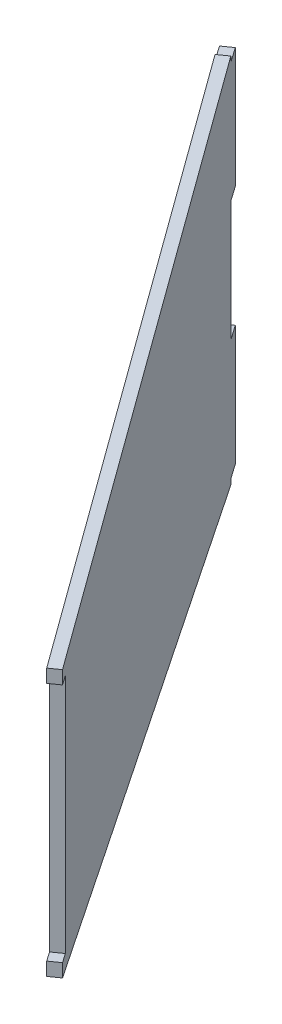
ISO-10303-21;
HEADER;
FILE_DESCRIPTION(('STEP AP214'),'2;1');
FILE_NAME('part.step','',(''),(''),'','','');
FILE_SCHEMA(('AUTOMOTIVE_DESIGN { 1 0 10303 214 1 1 1 1 }'));
ENDSEC;
DATA;
#1=APPLICATION_CONTEXT('core data for automotive mechanical design processes');
#2=APPLICATION_PROTOCOL_DEFINITION('international standard','automotive_design',2000,#1);
#3=PRODUCT_CONTEXT('',#1,'mechanical');
#4=PRODUCT('Part','Part','',(#3));
#5=PRODUCT_RELATED_PRODUCT_CATEGORY('part','',(#4));
#6=PRODUCT_DEFINITION_FORMATION('','',#4);
#7=PRODUCT_DEFINITION_CONTEXT('part definition',#1,'design');
#8=PRODUCT_DEFINITION('design','',#6,#7);
#9=PRODUCT_DEFINITION_SHAPE('','',#8);
#10=(LENGTH_UNIT() NAMED_UNIT(*) SI_UNIT(.MILLI.,.METRE.));
#11=(NAMED_UNIT(*) PLANE_ANGLE_UNIT() SI_UNIT($,.RADIAN.));
#12=(NAMED_UNIT(*) SI_UNIT($,.STERADIAN.) SOLID_ANGLE_UNIT());
#13=UNCERTAINTY_MEASURE_WITH_UNIT(LENGTH_MEASURE(1.E-05),#10,'distance_accuracy_value','');
#14=(GEOMETRIC_REPRESENTATION_CONTEXT(3) GLOBAL_UNCERTAINTY_ASSIGNED_CONTEXT((#13)) GLOBAL_UNIT_ASSIGNED_CONTEXT((#10,
#11,#12)) REPRESENTATION_CONTEXT('',''));
#15=CARTESIAN_POINT('',(0.,0.,0.));
#16=DIRECTION('',(0.,0.,1.));
#17=DIRECTION('',(1.,0.,0.));
#18=AXIS2_PLACEMENT_3D('',#15,#16,#17);
#19=CARTESIAN_POINT('',(1.48109673627812,-695.62516534234,9.52812624485346));
#20=DIRECTION('',(-0.574129568074744,0.,-0.818764458841679));
#21=DIRECTION('',(-0.818764458841679,0.,0.574129568074744));
#22=AXIS2_PLACEMENT_3D('',#19,#20,#21);
#23=PLANE('',#22);
#24=DIRECTION('',(0.,1.,0.));
#25=VECTOR('',#24,1.);
#26=CARTESIAN_POINT('',(10.1599999999999,-695.62516534234,3.44235282326117));
#27=LINE('',#26,#25);
#28=CARTESIAN_POINT('',(10.1599999999999,-695.62516534234,3.44235282326117));
#29=VERTEX_POINT('',#28);
#30=CARTESIAN_POINT('',(10.1599999999999,-690.62516534234,3.44235282326117));
#31=VERTEX_POINT('',#30);
#32=EDGE_CURVE('E184',#29,#31,#27,.T.);
#33=ORIENTED_EDGE('',*,*,#32,.F.);
#34=DIRECTION('',(0.818764458841679,0.,-0.574129568074744));
#35=VECTOR('',#34,1.);
#36=CARTESIAN_POINT('',(1.48109673627812,-695.62516534234,9.52812624485346));
#37=LINE('',#36,#35);
#38=CARTESIAN_POINT('',(1.48109673627812,-695.62516534234,9.52812624485346));
#39=VERTEX_POINT('',#38);
#40=EDGE_CURVE('E11',#39,#29,#37,.T.);
#41=ORIENTED_EDGE('',*,*,#40,.F.);
#42=DIRECTION('',(0.,1.,0.));
#43=VECTOR('',#42,1.);
#44=CARTESIAN_POINT('',(1.48109673627812,-695.62516534234,9.52812624485346));
#45=LINE('',#44,#43);
#46=CARTESIAN_POINT('',(1.48109673627812,-690.62516534234,9.52812624485346));
#47=VERTEX_POINT('',#46);
#48=EDGE_CURVE('E228',#39,#47,#45,.T.);
#49=ORIENTED_EDGE('',*,*,#48,.T.);
#50=DIRECTION('',(0.818764458841679,0.,-0.574129568074744));
#51=VECTOR('',#50,1.);
#52=CARTESIAN_POINT('',(1.48109673627812,-690.62516534234,9.52812624485346));
#53=LINE('',#52,#51);
#54=EDGE_CURVE('E42',#47,#31,#53,.T.);
#55=ORIENTED_EDGE('',*,*,#54,.T.);
#56=EDGE_LOOP('',(#33,#41,#49,#55));
#57=FACE_BOUND('',#56,.T.);
#58=ADVANCED_FACE('F39',(#57),#23,.T.);
#59=CARTESIAN_POINT('',(1.48109673627812,-695.62516534234,9.52812624485346));
#60=DIRECTION('',(0.,1.,0.));
#61=DIRECTION('',(-1.,0.,0.));
#62=AXIS2_PLACEMENT_3D('',#59,#60,#61);
#63=PLANE('',#62);
#64=DIRECTION('',(0.574129568074744,0.,0.818764458841679));
#65=VECTOR('',#64,1.);
#66=CARTESIAN_POINT('',(10.1599999999999,-695.62516534234,3.44235282326117));
#67=LINE('',#66,#65);
#68=CARTESIAN_POINT('',(0.399797342729262,-695.62516534234,-10.4766429770474));
#69=VERTEX_POINT('',#68);
#70=EDGE_CURVE('E226',#69,#29,#67,.T.);
#71=ORIENTED_EDGE('',*,*,#70,.F.);
#72=DIRECTION('',(0.818764458841679,0.,-0.574129568074744));
#73=VECTOR('',#72,1.);
#74=CARTESIAN_POINT('',(-8.27910592099254,-695.62516534234,-4.39086955545509));
#75=LINE('',#74,#73);
#76=CARTESIAN_POINT('',(-8.27910592099254,-695.62516534234,-4.39086955545509));
#77=VERTEX_POINT('',#76);
#78=EDGE_CURVE('E48',#77,#69,#75,.T.);
#79=ORIENTED_EDGE('',*,*,#78,.F.);
#80=DIRECTION('',(0.574129568074744,0.,0.818764458841679));
#81=VECTOR('',#80,1.);
#82=CARTESIAN_POINT('',(1.48109673627812,-695.62516534234,9.52812624485346));
#83=LINE('',#82,#81);
#84=EDGE_CURVE('E174',#77,#39,#83,.T.);
#85=ORIENTED_EDGE('',*,*,#84,.T.);
#86=ORIENTED_EDGE('',*,*,#40,.T.);
#87=EDGE_LOOP('',(#71,#79,#85,#86));
#88=FACE_BOUND('',#87,.T.);
#89=ADVANCED_FACE('F256',(#88),#63,.T.);
#90=CARTESIAN_POINT('',(-8.27910592099254,-695.62516534234,-4.39086955545509));
#91=DIRECTION('',(-0.574129568074744,0.,-0.818764458841679));
#92=DIRECTION('',(-0.818764458841679,0.,0.574129568074744));
#93=AXIS2_PLACEMENT_3D('',#90,#91,#92);
#94=PLANE('',#93);
#95=DIRECTION('',(0.,1.,0.));
#96=VECTOR('',#95,1.);
#97=CARTESIAN_POINT('',(0.399797342729262,-695.62516534234,-10.4766429770474));
#98=LINE('',#97,#96);
#99=CARTESIAN_POINT('',(0.399797342729266,-808.024914342338,-10.4766429770474));
#100=VERTEX_POINT('',#99);
#101=EDGE_CURVE('E161',#100,#69,#98,.T.);
#102=ORIENTED_EDGE('',*,*,#101,.F.);
#103=DIRECTION('',(0.818764458841679,0.,-0.574129568074744));
#104=VECTOR('',#103,1.);
#105=CARTESIAN_POINT('',(-8.27910592099253,-808.024914342338,-4.3908695554551));
#106=LINE('',#105,#104);
#107=CARTESIAN_POINT('',(-8.27910592099253,-808.024914342338,-4.3908695554551));
#108=VERTEX_POINT('',#107);
#109=EDGE_CURVE('E156',#108,#100,#106,.T.);
#110=ORIENTED_EDGE('',*,*,#109,.F.);
#111=DIRECTION('',(0.,1.,0.));
#112=VECTOR('',#111,1.);
#113=CARTESIAN_POINT('',(-8.27910592099254,-695.62516534234,-4.39086955545509));
#114=LINE('',#113,#112);
#115=EDGE_CURVE('E159',#108,#77,#114,.T.);
#116=ORIENTED_EDGE('',*,*,#115,.T.);
#117=ORIENTED_EDGE('',*,*,#78,.T.);
#118=EDGE_LOOP('',(#102,#110,#116,#117));
#119=FACE_BOUND('',#118,.T.);
#120=ADVANCED_FACE('F158',(#119),#94,.T.);
#121=CARTESIAN_POINT('',(-8.27910592099253,-808.024914342338,-4.3908695554551));
#122=DIRECTION('',(0.,-1.,0.));
#123=DIRECTION('',(1.,0.,0.));
#124=AXIS2_PLACEMENT_3D('',#121,#122,#123);
#125=PLANE('',#124);
#126=DIRECTION('',(-0.574129568074744,0.,-0.818764458841679));
#127=VECTOR('',#126,1.);
#128=CARTESIAN_POINT('',(0.399797342729266,-808.024914342338,-10.4766429770474));
#129=LINE('',#128,#127);
#130=CARTESIAN_POINT('',(10.1599999999999,-808.024914342338,3.44235282326115));
#131=VERTEX_POINT('',#130);
#132=EDGE_CURVE('E223',#131,#100,#129,.T.);
#133=ORIENTED_EDGE('',*,*,#132,.F.);
#134=DIRECTION('',(0.818764458841679,0.,-0.574129568074744));
#135=VECTOR('',#134,1.);
#136=CARTESIAN_POINT('',(1.48109673627812,-808.024914342338,9.52812624485344));
#137=LINE('',#136,#135);
#138=CARTESIAN_POINT('',(1.48109673627812,-808.024914342338,9.52812624485344));
#139=VERTEX_POINT('',#138);
#140=EDGE_CURVE('E166',#139,#131,#137,.T.);
#141=ORIENTED_EDGE('',*,*,#140,.F.);
#142=DIRECTION('',(-0.574129568074744,0.,-0.818764458841679));
#143=VECTOR('',#142,1.);
#144=CARTESIAN_POINT('',(-8.27910592099253,-808.024914342338,-4.3908695554551));
#145=LINE('',#144,#143);
#146=EDGE_CURVE('E172',#139,#108,#145,.T.);
#147=ORIENTED_EDGE('',*,*,#146,.T.);
#148=ORIENTED_EDGE('',*,*,#109,.T.);
#149=EDGE_LOOP('',(#133,#141,#147,#148));
#150=FACE_BOUND('',#149,.T.);
#151=ADVANCED_FACE('F176',(#150),#125,.T.);
#152=CARTESIAN_POINT('',(1.48109673627812,-808.024914342338,9.52812624485344));
#153=DIRECTION('',(-0.574129568074744,0.,-0.818764458841679));
#154=DIRECTION('',(-0.818764458841679,0.,0.574129568074744));
#155=AXIS2_PLACEMENT_3D('',#152,#153,#154);
#156=PLANE('',#155);
#157=DIRECTION('',(0.,1.,0.));
#158=VECTOR('',#157,1.);
#159=CARTESIAN_POINT('',(10.1599999999999,-808.024914342338,3.44235282326115));
#160=LINE('',#159,#158);
#161=CARTESIAN_POINT('',(10.1599999999999,-920.424663342338,3.44235282326115));
#162=VERTEX_POINT('',#161);
#163=EDGE_CURVE('E220',#162,#131,#160,.T.);
#164=ORIENTED_EDGE('',*,*,#163,.F.);
#165=DIRECTION('',(0.818764458841679,0.,-0.574129568074744));
#166=VECTOR('',#165,1.);
#167=CARTESIAN_POINT('',(1.48109673627813,-920.424663342338,9.52812624485344));
#168=LINE('',#167,#166);
#169=CARTESIAN_POINT('',(1.48109673627813,-920.424663342338,9.52812624485344));
#170=VERTEX_POINT('',#169);
#171=EDGE_CURVE('E232',#170,#162,#168,.T.);
#172=ORIENTED_EDGE('',*,*,#171,.F.);
#173=DIRECTION('',(0.,1.,0.));
#174=VECTOR('',#173,1.);
#175=CARTESIAN_POINT('',(1.48109673627812,-808.024914342338,9.52812624485344));
#176=LINE('',#175,#174);
#177=EDGE_CURVE('E177',#170,#139,#176,.T.);
#178=ORIENTED_EDGE('',*,*,#177,.T.);
#179=ORIENTED_EDGE('',*,*,#140,.T.);
#180=EDGE_LOOP('',(#164,#172,#178,#179));
#181=FACE_BOUND('',#180,.T.);
#182=ADVANCED_FACE('F269',(#181),#156,.T.);
#183=CARTESIAN_POINT('',(1.48109673627813,-920.424663342338,9.52812624485344));
#184=DIRECTION('',(0.,1.,0.));
#185=DIRECTION('',(-1.,0.,0.));
#186=AXIS2_PLACEMENT_3D('',#183,#184,#185);
#187=PLANE('',#186);
#188=DIRECTION('',(0.574129568074744,0.,0.818764458841679));
#189=VECTOR('',#188,1.);
#190=CARTESIAN_POINT('',(10.1599999999999,-920.424663342338,3.44235282326115));
#191=LINE('',#190,#189);
#192=CARTESIAN_POINT('',(0.399797342729271,-920.424663342338,-10.4766429770474));
#193=VERTEX_POINT('',#192);
#194=EDGE_CURVE('E217',#193,#162,#191,.T.);
#195=ORIENTED_EDGE('',*,*,#194,.F.);
#196=DIRECTION('',(0.818764458841679,0.,-0.574129568074744));
#197=VECTOR('',#196,1.);
#198=CARTESIAN_POINT('',(-8.27910592099253,-920.424663342338,-4.39086955545511));
#199=LINE('',#198,#197);
#200=CARTESIAN_POINT('',(-8.27910592099253,-920.424663342338,-4.39086955545511));
#201=VERTEX_POINT('',#200);
#202=EDGE_CURVE('E234',#201,#193,#199,.T.);
#203=ORIENTED_EDGE('',*,*,#202,.F.);
#204=DIRECTION('',(0.574129568074744,0.,0.818764458841679));
#205=VECTOR('',#204,1.);
#206=CARTESIAN_POINT('',(1.48109673627813,-920.424663342338,9.52812624485344));
#207=LINE('',#206,#205);
#208=EDGE_CURVE('E179',#201,#170,#207,.T.);
#209=ORIENTED_EDGE('',*,*,#208,.T.);
#210=ORIENTED_EDGE('',*,*,#171,.T.);
#211=EDGE_LOOP('',(#195,#203,#209,#210));
#212=FACE_BOUND('',#211,.T.);
#213=ADVANCED_FACE('F272',(#212),#187,.T.);
#214=CARTESIAN_POINT('',(-8.27910592099253,-920.424663342338,-4.39086955545511));
#215=DIRECTION('',(-0.574129568074744,0.,-0.818764458841679));
#216=DIRECTION('',(-0.818764458841679,0.,0.574129568074744));
#217=AXIS2_PLACEMENT_3D('',#214,#215,#216);
#218=PLANE('',#217);
#219=DIRECTION('',(0.,1.,0.));
#220=VECTOR('',#219,1.);
#221=CARTESIAN_POINT('',(0.399797342729271,-920.424663342338,-10.4766429770474));
#222=LINE('',#221,#220);
#223=CARTESIAN_POINT('',(0.399797342729275,-1032.82441234234,-10.4766429770474));
#224=VERTEX_POINT('',#223);
#225=EDGE_CURVE('E214',#224,#193,#222,.T.);
#226=ORIENTED_EDGE('',*,*,#225,.F.);
#227=DIRECTION('',(0.818764458841679,0.,-0.574129568074744));
#228=VECTOR('',#227,1.);
#229=CARTESIAN_POINT('',(-8.27910592099252,-1032.82441234234,-4.39086955545513));
#230=LINE('',#229,#228);
#231=CARTESIAN_POINT('',(-8.27910592099252,-1032.82441234234,-4.39086955545513));
#232=VERTEX_POINT('',#231);
#233=EDGE_CURVE('E236',#232,#224,#230,.T.);
#234=ORIENTED_EDGE('',*,*,#233,.F.);
#235=DIRECTION('',(0.,1.,0.));
#236=VECTOR('',#235,1.);
#237=CARTESIAN_POINT('',(-8.27910592099253,-920.424663342338,-4.39086955545511));
#238=LINE('',#237,#236);
#239=EDGE_CURVE('E489',#232,#201,#238,.T.);
#240=ORIENTED_EDGE('',*,*,#239,.T.);
#241=ORIENTED_EDGE('',*,*,#202,.T.);
#242=EDGE_LOOP('',(#226,#234,#240,#241));
#243=FACE_BOUND('',#242,.T.);
#244=ADVANCED_FACE('F276',(#243),#218,.T.);
#245=CARTESIAN_POINT('',(-8.27910592099252,-1032.82441234234,-4.39086955545513));
#246=DIRECTION('',(0.,-1.,0.));
#247=DIRECTION('',(1.,0.,0.));
#248=AXIS2_PLACEMENT_3D('',#245,#246,#247);
#249=PLANE('',#248);
#250=DIRECTION('',(-0.574129568074744,0.,-0.818764458841679));
#251=VECTOR('',#250,1.);
#252=CARTESIAN_POINT('',(0.399797342729275,-1032.82441234234,-10.4766429770474));
#253=LINE('',#252,#251);
#254=CARTESIAN_POINT('',(10.1599999999999,-1032.82441234234,3.44235282326115));
#255=VERTEX_POINT('',#254);
#256=EDGE_CURVE('E211',#255,#224,#253,.T.);
#257=ORIENTED_EDGE('',*,*,#256,.F.);
#258=DIRECTION('',(0.818764458841679,0.,-0.574129568074744));
#259=VECTOR('',#258,1.);
#260=CARTESIAN_POINT('',(1.48109673627814,-1032.82441234234,9.52812624485344));
#261=LINE('',#260,#259);
#262=CARTESIAN_POINT('',(1.48109673627814,-1032.82441234234,9.52812624485344));
#263=VERTEX_POINT('',#262);
#264=EDGE_CURVE('E238',#263,#255,#261,.T.);
#265=ORIENTED_EDGE('',*,*,#264,.F.);
#266=DIRECTION('',(-0.574129568074744,0.,-0.818764458841679));
#267=VECTOR('',#266,1.);
#268=CARTESIAN_POINT('',(-8.27910592099252,-1032.82441234234,-4.39086955545513));
#269=LINE('',#268,#267);
#270=EDGE_CURVE('E485',#263,#232,#269,.T.);
#271=ORIENTED_EDGE('',*,*,#270,.T.);
#272=ORIENTED_EDGE('',*,*,#233,.T.);
#273=EDGE_LOOP('',(#257,#265,#271,#272));
#274=FACE_BOUND('',#273,.T.);
#275=ADVANCED_FACE('F280',(#274),#249,.T.);
#276=CARTESIAN_POINT('',(1.48109673627814,-1032.82441234234,9.52812624485344));
#277=DIRECTION('',(-0.574129568074744,0.,-0.818764458841679));
#278=DIRECTION('',(-0.818764458841679,0.,0.574129568074744));
#279=AXIS2_PLACEMENT_3D('',#276,#277,#278);
#280=PLANE('',#279);
#281=DIRECTION('',(0.,1.,0.));
#282=VECTOR('',#281,1.);
#283=CARTESIAN_POINT('',(10.1599999999999,-1032.82441234234,3.44235282326115));
#284=LINE('',#283,#282);
#285=CARTESIAN_POINT('',(10.16,-1037.82441234234,3.44235282326116));
#286=VERTEX_POINT('',#285);
#287=EDGE_CURVE('E208',#286,#255,#284,.T.);
#288=ORIENTED_EDGE('',*,*,#287,.F.);
#289=DIRECTION('',(0.818764458841679,0.,-0.574129568074744));
#290=VECTOR('',#289,1.);
#291=CARTESIAN_POINT('',(1.48109673627815,-1037.82441234234,9.52812624485345));
#292=LINE('',#291,#290);
#293=CARTESIAN_POINT('',(1.48109673627815,-1037.82441234234,9.52812624485345));
#294=VERTEX_POINT('',#293);
#295=EDGE_CURVE('E240',#294,#286,#292,.T.);
#296=ORIENTED_EDGE('',*,*,#295,.F.);
#297=DIRECTION('',(0.,1.,0.));
#298=VECTOR('',#297,1.);
#299=CARTESIAN_POINT('',(1.48109673627814,-1032.82441234234,9.52812624485344));
#300=LINE('',#299,#298);
#301=EDGE_CURVE('E496',#294,#263,#300,.T.);
#302=ORIENTED_EDGE('',*,*,#301,.T.);
#303=ORIENTED_EDGE('',*,*,#264,.T.);
#304=EDGE_LOOP('',(#288,#296,#302,#303));
#305=FACE_BOUND('',#304,.T.);
#306=ADVANCED_FACE('F284',(#305),#280,.T.);
#307=CARTESIAN_POINT('',(370.702657139949,-989.024288414982,536.073888572209));
#308=DIRECTION('',(0.0434417093838883,-0.997133269033899,0.0619520917449528));
#309=DIRECTION('',(0.,-0.0620106320549041,-0.998075488884559));
#310=AXIS2_PLACEMENT_3D('',#307,#308,#309);
#311=PLANE('',#310);
#312=DIRECTION('',(-0.572483693063391,-0.0756653407166667,-0.816417281413575));
#313=VECTOR('',#312,1.);
#314=CARTESIAN_POINT('',(379.38156040367,-989.024288414982,529.988115150617));
#315=LINE('',#314,#313);
#316=CARTESIAN_POINT('',(379.38156040367,-989.024288414982,529.988115150617));
#317=VERTEX_POINT('',#316);
#318=EDGE_CURVE('E205',#317,#286,#315,.T.);
#319=ORIENTED_EDGE('',*,*,#318,.F.);
#320=DIRECTION('',(0.818764458841679,0.,-0.574129568074744));
#321=VECTOR('',#320,1.);
#322=CARTESIAN_POINT('',(370.702657139949,-989.024288414982,536.073888572209));
#323=LINE('',#322,#321);
#324=CARTESIAN_POINT('',(370.702657139949,-989.024288414982,536.073888572209));
#325=VERTEX_POINT('',#324);
#326=EDGE_CURVE('E242',#325,#317,#323,.T.);
#327=ORIENTED_EDGE('',*,*,#326,.F.);
#328=DIRECTION('',(-0.572483693063391,-0.0756653407166667,-0.816417281413575));
#329=VECTOR('',#328,1.);
#330=CARTESIAN_POINT('',(370.702657139949,-989.024288414982,536.073888572209));
#331=LINE('',#330,#329);
#332=EDGE_CURVE('E478',#325,#294,#331,.T.);
#333=ORIENTED_EDGE('',*,*,#332,.T.);
#334=ORIENTED_EDGE('',*,*,#295,.T.);
#335=EDGE_LOOP('',(#319,#327,#333,#334));
#336=FACE_BOUND('',#335,.T.);
#337=ADVANCED_FACE('F288',(#336),#311,.T.);
#338=CARTESIAN_POINT('',(370.702657139949,-989.024288414982,536.073888572209));
#339=DIRECTION('',(0.574129568074744,1.91518887099014E-12,0.818764458841679));
#340=DIRECTION('',(0.818764458841679,0.,-0.574129568074744));
#341=AXIS2_PLACEMENT_3D('',#338,#339,#340);
#342=PLANE('',#341);
#343=DIRECTION('',(1.10129191222916E-12,-1.,1.56687873691141E-12));
#344=VECTOR('',#343,1.);
#345=CARTESIAN_POINT('',(379.38156040367,-989.024288414982,529.988115150617));
#346=LINE('',#345,#344);
#347=CARTESIAN_POINT('',(379.381560403657,-976.624539491694,529.988115150597));
#348=VERTEX_POINT('',#347);
#349=EDGE_CURVE('E202',#348,#317,#346,.T.);
#350=ORIENTED_EDGE('',*,*,#349,.F.);
#351=DIRECTION('',(0.818764458841679,0.,-0.574129568074744));
#352=VECTOR('',#351,1.);
#353=CARTESIAN_POINT('',(370.702657139935,-976.624539491694,536.07388857219));
#354=LINE('',#353,#352);
#355=CARTESIAN_POINT('',(370.702657139935,-976.624539491694,536.07388857219));
#356=VERTEX_POINT('',#355);
#357=EDGE_CURVE('E244',#356,#348,#354,.T.);
#358=ORIENTED_EDGE('',*,*,#357,.F.);
#359=DIRECTION('',(1.10129191222916E-12,-1.,1.56687873691141E-12));
#360=VECTOR('',#359,1.);
#361=CARTESIAN_POINT('',(370.702657139949,-989.024288414982,536.073888572209));
#362=LINE('',#361,#360);
#363=EDGE_CURVE('E474',#356,#325,#362,.T.);
#364=ORIENTED_EDGE('',*,*,#363,.T.);
#365=ORIENTED_EDGE('',*,*,#326,.T.);
#366=EDGE_LOOP('',(#350,#358,#364,#365));
#367=FACE_BOUND('',#366,.T.);
#368=ADVANCED_FACE('F292',(#367),#342,.T.);
#369=CARTESIAN_POINT('',(370.702657139935,-976.624539491694,536.07388857219));
#370=DIRECTION('',(0.,1.,0.));
#371=DIRECTION('',(-1.,0.,0.));
#372=AXIS2_PLACEMENT_3D('',#369,#370,#371);
#373=PLANE('',#372);
#374=DIRECTION('',(0.574129568074747,0.,0.818764458841677));
#375=VECTOR('',#374,1.);
#376=CARTESIAN_POINT('',(379.381560403657,-976.624539491694,529.988115150597));
#377=LINE('',#376,#375);
#378=CARTESIAN_POINT('',(373.283183814304,-976.624539491694,521.291238547049));
#379=VERTEX_POINT('',#378);
#380=EDGE_CURVE('E199',#379,#348,#377,.T.);
#381=ORIENTED_EDGE('',*,*,#380,.F.);
#382=DIRECTION('',(0.818764458841679,0.,-0.574129568074744));
#383=VECTOR('',#382,1.);
#384=CARTESIAN_POINT('',(364.604280550582,-976.624539491694,527.377011968641));
#385=LINE('',#384,#383);
#386=CARTESIAN_POINT('',(364.604280550582,-976.624539491694,527.377011968641));
#387=VERTEX_POINT('',#386);
#388=EDGE_CURVE('E246',#387,#379,#385,.T.);
#389=ORIENTED_EDGE('',*,*,#388,.F.);
#390=DIRECTION('',(0.574129568074747,0.,0.818764458841677));
#391=VECTOR('',#390,1.);
#392=CARTESIAN_POINT('',(370.702657139935,-976.624539491694,536.07388857219));
#393=LINE('',#392,#391);
#394=EDGE_CURVE('E500',#387,#356,#393,.T.);
#395=ORIENTED_EDGE('',*,*,#394,.T.);
#396=ORIENTED_EDGE('',*,*,#357,.T.);
#397=EDGE_LOOP('',(#381,#389,#395,#396));
#398=FACE_BOUND('',#397,.T.);
#399=ADVANCED_FACE('F296',(#398),#373,.T.);
#400=CARTESIAN_POINT('',(364.604280550582,-976.624539491694,527.377011968641));
#401=DIRECTION('',(0.574129568074744,0.,0.818764458841679));
#402=DIRECTION('',(0.818764458841679,0.,-0.574129568074744));
#403=AXIS2_PLACEMENT_3D('',#400,#401,#402);
#404=PLANE('',#403);
#405=DIRECTION('',(0.,-1.,0.));
#406=VECTOR('',#405,1.);
#407=CARTESIAN_POINT('',(373.283183814304,-976.624539491694,521.291238547049));
#408=LINE('',#407,#406);
#409=CARTESIAN_POINT('',(373.283183814304,-751.825039567327,521.291238547049));
#410=VERTEX_POINT('',#409);
#411=EDGE_CURVE('E196',#410,#379,#408,.T.);
#412=ORIENTED_EDGE('',*,*,#411,.F.);
#413=DIRECTION('',(0.818764458841679,0.,-0.574129568074744));
#414=VECTOR('',#413,1.);
#415=CARTESIAN_POINT('',(364.604280550582,-751.825039567327,527.377011968641));
#416=LINE('',#415,#414);
#417=CARTESIAN_POINT('',(364.604280550582,-751.825039567327,527.377011968641));
#418=VERTEX_POINT('',#417);
#419=EDGE_CURVE('E248',#418,#410,#416,.T.);
#420=ORIENTED_EDGE('',*,*,#419,.F.);
#421=DIRECTION('',(0.,-1.,0.));
#422=VECTOR('',#421,1.);
#423=CARTESIAN_POINT('',(364.604280550582,-976.624539491694,527.377011968641));
#424=LINE('',#423,#422);
#425=EDGE_CURVE('E467',#418,#387,#424,.T.);
#426=ORIENTED_EDGE('',*,*,#425,.T.);
#427=ORIENTED_EDGE('',*,*,#388,.T.);
#428=EDGE_LOOP('',(#412,#420,#426,#427));
#429=FACE_BOUND('',#428,.T.);
#430=ADVANCED_FACE('F300',(#429),#404,.T.);
#431=CARTESIAN_POINT('',(370.702657139688,-751.825039567327,536.073888571837));
#432=DIRECTION('',(0.,-1.,0.));
#433=DIRECTION('',(1.,0.,0.));
#434=AXIS2_PLACEMENT_3D('',#431,#432,#433);
#435=PLANE('',#434);
#436=DIRECTION('',(-0.574129568074743,0.,-0.81876445884168));
#437=VECTOR('',#436,1.);
#438=CARTESIAN_POINT('',(379.38156040341,-751.825039567327,529.988115150245));
#439=LINE('',#438,#437);
#440=CARTESIAN_POINT('',(379.38156040341,-751.825039567327,529.988115150245));
#441=VERTEX_POINT('',#440);
#442=EDGE_CURVE('E193',#441,#410,#439,.T.);
#443=ORIENTED_EDGE('',*,*,#442,.F.);
#444=DIRECTION('',(0.818764458841679,0.,-0.574129568074744));
#445=VECTOR('',#444,1.);
#446=CARTESIAN_POINT('',(370.702657139688,-751.825039567327,536.073888571837));
#447=LINE('',#446,#445);
#448=CARTESIAN_POINT('',(370.702657139688,-751.825039567327,536.073888571837));
#449=VERTEX_POINT('',#448);
#450=EDGE_CURVE('E250',#449,#441,#447,.T.);
#451=ORIENTED_EDGE('',*,*,#450,.F.);
#452=DIRECTION('',(-0.574129568074743,0.,-0.81876445884168));
#453=VECTOR('',#452,1.);
#454=CARTESIAN_POINT('',(370.702657139688,-751.825039567327,536.073888571837));
#455=LINE('',#454,#453);
#456=EDGE_CURVE('E463',#449,#418,#455,.T.);
#457=ORIENTED_EDGE('',*,*,#456,.T.);
#458=ORIENTED_EDGE('',*,*,#419,.T.);
#459=EDGE_LOOP('',(#443,#451,#457,#458));
#460=FACE_BOUND('',#459,.T.);
#461=ADVANCED_FACE('F304',(#460),#435,.T.);
#462=CARTESIAN_POINT('',(370.702657139688,-751.825039567327,536.073888571837));
#463=DIRECTION('',(0.574129568074744,1.91261860981171E-12,0.818764458841679));
#464=DIRECTION('',(0.818764458841679,0.,-0.574129568074744));
#465=AXIS2_PLACEMENT_3D('',#462,#463,#464);
#466=PLANE('',#465);
#467=DIRECTION('',(1.09681511583798E-12,-1.,1.56687873691141E-12));
#468=VECTOR('',#467,1.);
#469=CARTESIAN_POINT('',(379.38156040341,-751.825039567327,529.988115150245));
#470=LINE('',#469,#468);
#471=CARTESIAN_POINT('',(379.381560403396,-739.425290644039,529.988115150226));
#472=VERTEX_POINT('',#471);
#473=EDGE_CURVE('E190',#472,#441,#470,.T.);
#474=ORIENTED_EDGE('',*,*,#473,.F.);
#475=DIRECTION('',(0.818764458841679,0.,-0.574129568074744));
#476=VECTOR('',#475,1.);
#477=CARTESIAN_POINT('',(370.702657139674,-739.425290644039,536.073888571818));
#478=LINE('',#477,#476);
#479=CARTESIAN_POINT('',(370.702657139674,-739.425290644039,536.073888571818));
#480=VERTEX_POINT('',#479);
#481=EDGE_CURVE('E251',#480,#472,#478,.T.);
#482=ORIENTED_EDGE('',*,*,#481,.F.);
#483=DIRECTION('',(1.09681511583798E-12,-1.,1.56687873691141E-12));
#484=VECTOR('',#483,1.);
#485=CARTESIAN_POINT('',(370.702657139688,-751.825039567327,536.073888571837));
#486=LINE('',#485,#484);
#487=EDGE_CURVE('E504',#480,#449,#486,.T.);
#488=ORIENTED_EDGE('',*,*,#487,.T.);
#489=ORIENTED_EDGE('',*,*,#450,.T.);
#490=EDGE_LOOP('',(#474,#482,#488,#489));
#491=FACE_BOUND('',#490,.T.);
#492=ADVANCED_FACE('F308',(#491),#466,.T.);
#493=CARTESIAN_POINT('',(370.702657139674,-739.425290644039,536.073888571818));
#494=DIRECTION('',(0.0434417106003531,0.997133268873119,0.06195209347975));
#495=DIRECTION('',(0.,-0.0620106337946237,0.99807548877647));
#496=AXIS2_PLACEMENT_3D('',#493,#494,#495);
#497=PLANE('',#496);
#498=DIRECTION('',(0.572483692971082,-0.0756653428354654,0.816417281281934));
#499=VECTOR('',#498,1.);
#500=CARTESIAN_POINT('',(379.381560403396,-739.425290644039,529.988115150226));
#501=LINE('',#500,#499);
#502=EDGE_CURVE('E187',#31,#472,#501,.T.);
#503=ORIENTED_EDGE('',*,*,#502,.F.);
#504=ORIENTED_EDGE('',*,*,#54,.F.);
#505=DIRECTION('',(0.572483692971082,-0.0756653428354654,0.816417281281934));
#506=VECTOR('',#505,1.);
#507=CARTESIAN_POINT('',(370.702657139674,-739.425290644039,536.073888571818));
#508=LINE('',#507,#506);
#509=EDGE_CURVE('E506',#47,#480,#508,.T.);
#510=ORIENTED_EDGE('',*,*,#509,.T.);
#511=ORIENTED_EDGE('',*,*,#481,.T.);
#512=EDGE_LOOP('',(#503,#504,#510,#511));
#513=FACE_BOUND('',#512,.T.);
#514=ADVANCED_FACE('F253',(#513),#497,.T.);
#515=CARTESIAN_POINT('',(-3.48606132745554,0.,2.4444769953078));
#516=DIRECTION('',(-0.81876445884168,0.,0.574129568074743));
#517=DIRECTION('',(0.574129568074743,0.,0.81876445884168));
#518=AXIS2_PLACEMENT_3D('',#515,#516,#517);
#519=PLANE('',#518);
#520=ORIENTED_EDGE('',*,*,#48,.F.);
#521=ORIENTED_EDGE('',*,*,#84,.F.);
#522=ORIENTED_EDGE('',*,*,#115,.F.);
#523=ORIENTED_EDGE('',*,*,#146,.F.);
#524=ORIENTED_EDGE('',*,*,#177,.F.);
#525=ORIENTED_EDGE('',*,*,#208,.F.);
#526=ORIENTED_EDGE('',*,*,#239,.F.);
#527=ORIENTED_EDGE('',*,*,#270,.F.);
#528=ORIENTED_EDGE('',*,*,#301,.F.);
#529=ORIENTED_EDGE('',*,*,#332,.F.);
#530=ORIENTED_EDGE('',*,*,#363,.F.);
#531=ORIENTED_EDGE('',*,*,#394,.F.);
#532=ORIENTED_EDGE('',*,*,#425,.F.);
#533=ORIENTED_EDGE('',*,*,#456,.F.);
#534=ORIENTED_EDGE('',*,*,#487,.F.);
#535=ORIENTED_EDGE('',*,*,#509,.F.);
#536=EDGE_LOOP('',(#520,#521,#522,#523,#524,#525,#526,#527,#528,#529,#530,#531,#532,#533,#534,#535));
#537=FACE_BOUND('',#536,.T.);
#538=ADVANCED_FACE('F170',(#537),#519,.T.);
#539=CARTESIAN_POINT('',(5.19284193626626,0.,-3.64129642628449));
#540=DIRECTION('',(-0.81876445884168,0.,0.574129568074743));
#541=DIRECTION('',(0.574129568074743,0.,0.81876445884168));
#542=AXIS2_PLACEMENT_3D('',#539,#540,#541);
#543=PLANE('',#542);
#544=ORIENTED_EDGE('',*,*,#32,.T.);
#545=ORIENTED_EDGE('',*,*,#502,.T.);
#546=ORIENTED_EDGE('',*,*,#473,.T.);
#547=ORIENTED_EDGE('',*,*,#442,.T.);
#548=ORIENTED_EDGE('',*,*,#411,.T.);
#549=ORIENTED_EDGE('',*,*,#380,.T.);
#550=ORIENTED_EDGE('',*,*,#349,.T.);
#551=ORIENTED_EDGE('',*,*,#318,.T.);
#552=ORIENTED_EDGE('',*,*,#287,.T.);
#553=ORIENTED_EDGE('',*,*,#256,.T.);
#554=ORIENTED_EDGE('',*,*,#225,.T.);
#555=ORIENTED_EDGE('',*,*,#194,.T.);
#556=ORIENTED_EDGE('',*,*,#163,.T.);
#557=ORIENTED_EDGE('',*,*,#132,.T.);
#558=ORIENTED_EDGE('',*,*,#101,.T.);
#559=ORIENTED_EDGE('',*,*,#70,.T.);
#560=EDGE_LOOP('',(#544,#545,#546,#547,#548,#549,#550,#551,#552,#553,#554,#555,#556,#557,#558,#559));
#561=FACE_BOUND('',#560,.T.);
#562=ADVANCED_FACE('F255',(#561),#543,.F.);
#563=CLOSED_SHELL('',(#58,#89,#120,#151,#182,#213,#244,#275,#306,#337,#368,#399,#430,#461,#492,
#514,#538,#562));
#564=MANIFOLD_SOLID_BREP('B2',#563);
#565=ADVANCED_BREP_SHAPE_REPRESENTATION('',(#18,#564),#14);
#566=SHAPE_DEFINITION_REPRESENTATION(#9,#565);
ENDSEC;
END-ISO-10303-21;
